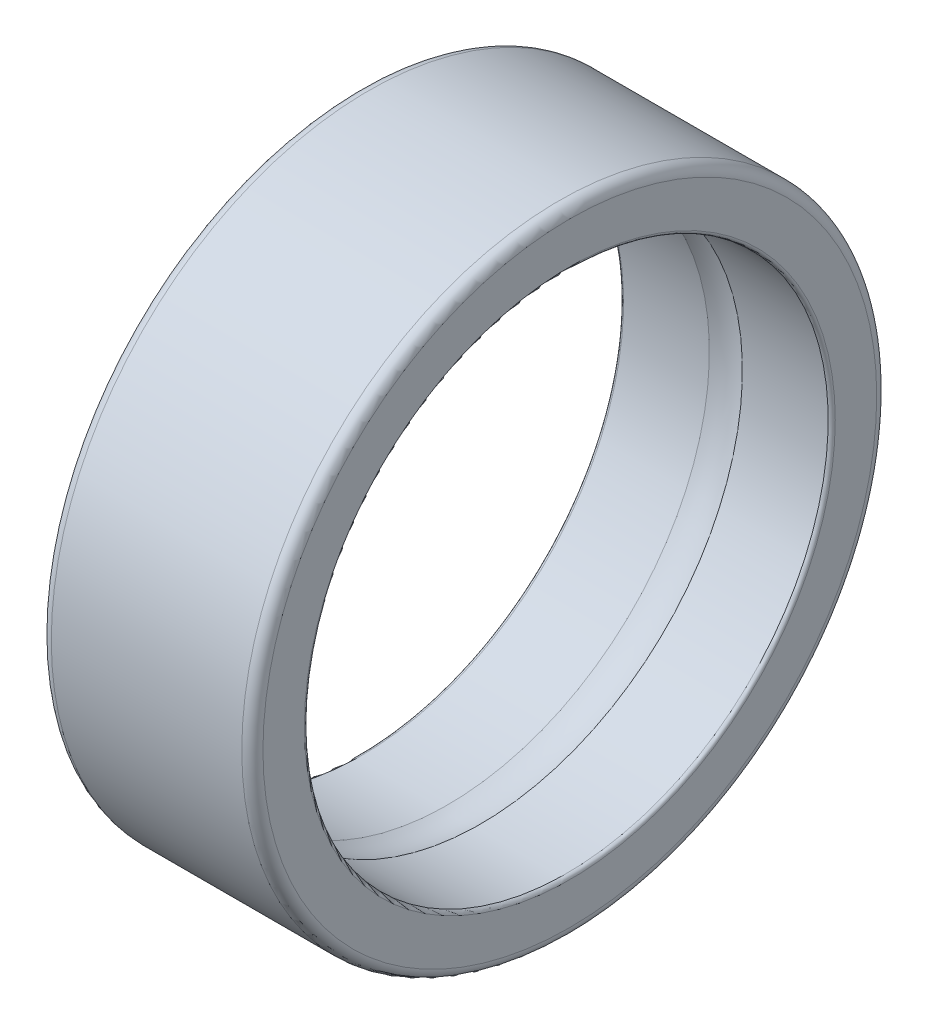
ISO-10303-21;
HEADER;
FILE_DESCRIPTION(('STEP AP214'),'2;1');
FILE_NAME('part.step','',(''),(''),'','','');
FILE_SCHEMA(('AUTOMOTIVE_DESIGN { 1 0 10303 214 1 1 1 1 }'));
ENDSEC;
DATA;
#1=APPLICATION_CONTEXT('core data for automotive mechanical design processes');
#2=APPLICATION_PROTOCOL_DEFINITION('international standard','automotive_design',2000,#1);
#3=PRODUCT_CONTEXT('',#1,'mechanical');
#4=PRODUCT('Part','Part','',(#3));
#5=PRODUCT_RELATED_PRODUCT_CATEGORY('part','',(#4));
#6=PRODUCT_DEFINITION_FORMATION('','',#4);
#7=PRODUCT_DEFINITION_CONTEXT('part definition',#1,'design');
#8=PRODUCT_DEFINITION('design','',#6,#7);
#9=PRODUCT_DEFINITION_SHAPE('','',#8);
#10=(LENGTH_UNIT() NAMED_UNIT(*) SI_UNIT(.MILLI.,.METRE.));
#11=(NAMED_UNIT(*) PLANE_ANGLE_UNIT() SI_UNIT($,.RADIAN.));
#12=(NAMED_UNIT(*) SI_UNIT($,.STERADIAN.) SOLID_ANGLE_UNIT());
#13=UNCERTAINTY_MEASURE_WITH_UNIT(LENGTH_MEASURE(1.E-05),#10,'distance_accuracy_value','');
#14=(GEOMETRIC_REPRESENTATION_CONTEXT(3) GLOBAL_UNCERTAINTY_ASSIGNED_CONTEXT((#13)) GLOBAL_UNIT_ASSIGNED_CONTEXT((#10,
#11,#12)) REPRESENTATION_CONTEXT('',''));
#15=CARTESIAN_POINT('',(0.,0.,0.));
#16=DIRECTION('',(0.,0.,1.));
#17=DIRECTION('',(1.,0.,0.));
#18=AXIS2_PLACEMENT_3D('',#15,#16,#17);
#19=CARTESIAN_POINT('',(0.0666666666667283,0.,0.));
#20=DIRECTION('',(-1.,0.,0.));
#21=DIRECTION('',(0.,0.,1.));
#22=AXIS2_PLACEMENT_3D('',#19,#20,#21);
#23=TOROIDAL_SURFACE('',#22,5.01666666666673,0.0666666666667281);
#24=CARTESIAN_POINT('',(0.0666666666666671,0.,0.));
#25=DIRECTION('',(-1.,0.,0.));
#26=DIRECTION('',(0.,0.,1.));
#27=AXIS2_PLACEMENT_3D('',#24,#25,#26);
#28=CIRCLE('',#27,4.95);
#29=CARTESIAN_POINT('',(0.0666666666666671,0.,4.95));
#30=VERTEX_POINT('',#29);
#31=EDGE_CURVE('E10',#30,#30,#28,.T.);
#32=ORIENTED_EDGE('',*,*,#31,.F.);
#33=EDGE_LOOP('',(#32));
#34=FACE_BOUND('',#33,.T.);
#35=CARTESIAN_POINT('',(0.,0.,0.));
#36=DIRECTION('',(-1.,0.,0.));
#37=DIRECTION('',(0.,0.,1.));
#38=AXIS2_PLACEMENT_3D('',#35,#36,#37);
#39=CIRCLE('',#38,5.0166666666667);
#40=CARTESIAN_POINT('',(0.,0.,5.0166666666667));
#41=VERTEX_POINT('',#40);
#42=EDGE_CURVE('E69',#41,#41,#39,.T.);
#43=ORIENTED_EDGE('',*,*,#42,.T.);
#44=EDGE_LOOP('',(#43));
#45=FACE_BOUND('',#44,.T.);
#46=ADVANCED_FACE('F35',(#34,#45),#23,.T.);
#47=CARTESIAN_POINT('',(4.,0.,0.));
#48=DIRECTION('',(-1.,0.,0.));
#49=DIRECTION('',(0.,0.,1.));
#50=AXIS2_PLACEMENT_3D('',#47,#48,#49);
#51=CYLINDRICAL_SURFACE('',#50,4.95);
#52=CARTESIAN_POINT('',(1.6877501000801,0.,0.));
#53=DIRECTION('',(-1.,0.,0.));
#54=DIRECTION('',(0.,0.,1.));
#55=AXIS2_PLACEMENT_3D('',#52,#53,#54);
#56=CIRCLE('',#55,4.95);
#57=CARTESIAN_POINT('',(1.6877501000801,0.,4.95));
#58=VERTEX_POINT('',#57);
#59=EDGE_CURVE('E41',#58,#58,#56,.T.);
#60=ORIENTED_EDGE('',*,*,#59,.F.);
#61=EDGE_LOOP('',(#60));
#62=FACE_BOUND('',#61,.T.);
#63=ORIENTED_EDGE('',*,*,#31,.T.);
#64=EDGE_LOOP('',(#63));
#65=FACE_BOUND('',#64,.T.);
#66=ADVANCED_FACE('F118',(#62,#65),#51,.F.);
#67=CARTESIAN_POINT('',(2.,0.,0.));
#68=DIRECTION('',(-1.,0.,0.));
#69=DIRECTION('',(0.,0.,1.));
#70=AXIS2_PLACEMENT_3D('',#67,#68,#69);
#71=TOROIDAL_SURFACE('',#70,4.00000000000012,0.999999999999885);
#72=CARTESIAN_POINT('',(2.3122498999199,0.,0.));
#73=DIRECTION('',(-1.,0.,0.));
#74=DIRECTION('',(0.,0.,1.));
#75=AXIS2_PLACEMENT_3D('',#72,#73,#74);
#76=CIRCLE('',#75,4.95);
#77=CARTESIAN_POINT('',(2.3122498999199,0.,4.95));
#78=VERTEX_POINT('',#77);
#79=EDGE_CURVE('E45',#78,#78,#76,.T.);
#80=ORIENTED_EDGE('',*,*,#79,.F.);
#81=EDGE_LOOP('',(#80));
#82=FACE_BOUND('',#81,.T.);
#83=ORIENTED_EDGE('',*,*,#59,.T.);
#84=EDGE_LOOP('',(#83));
#85=FACE_BOUND('',#84,.T.);
#86=ADVANCED_FACE('F113',(#82,#85),#71,.F.);
#87=CARTESIAN_POINT('',(4.,0.,0.));
#88=DIRECTION('',(-1.,0.,0.));
#89=DIRECTION('',(0.,0.,1.));
#90=AXIS2_PLACEMENT_3D('',#87,#88,#89);
#91=CYLINDRICAL_SURFACE('',#90,4.95);
#92=CARTESIAN_POINT('',(3.9333333333333,0.,0.));
#93=DIRECTION('',(-1.,0.,0.));
#94=DIRECTION('',(0.,0.,1.));
#95=AXIS2_PLACEMENT_3D('',#92,#93,#94);
#96=CIRCLE('',#95,4.95);
#97=CARTESIAN_POINT('',(3.9333333333333,0.,4.95));
#98=VERTEX_POINT('',#97);
#99=EDGE_CURVE('E49',#98,#98,#96,.T.);
#100=ORIENTED_EDGE('',*,*,#99,.F.);
#101=EDGE_LOOP('',(#100));
#102=FACE_BOUND('',#101,.T.);
#103=ORIENTED_EDGE('',*,*,#79,.T.);
#104=EDGE_LOOP('',(#103));
#105=FACE_BOUND('',#104,.T.);
#106=ADVANCED_FACE('F107',(#102,#105),#91,.F.);
#107=CARTESIAN_POINT('',(3.93333333333321,0.,0.));
#108=DIRECTION('',(-1.,0.,0.));
#109=DIRECTION('',(0.,0.,1.));
#110=AXIS2_PLACEMENT_3D('',#107,#108,#109);
#111=TOROIDAL_SURFACE('',#110,5.01666666666679,0.066666666666792);
#112=CARTESIAN_POINT('',(4.,0.,0.));
#113=DIRECTION('',(-1.,0.,0.));
#114=DIRECTION('',(0.,0.,1.));
#115=AXIS2_PLACEMENT_3D('',#112,#113,#114);
#116=CIRCLE('',#115,5.01666666666661);
#117=CARTESIAN_POINT('',(4.,0.,5.01666666666661));
#118=VERTEX_POINT('',#117);
#119=EDGE_CURVE('E54',#118,#118,#116,.T.);
#120=ORIENTED_EDGE('',*,*,#119,.F.);
#121=EDGE_LOOP('',(#120));
#122=FACE_BOUND('',#121,.T.);
#123=ORIENTED_EDGE('',*,*,#99,.T.);
#124=EDGE_LOOP('',(#123));
#125=FACE_BOUND('',#124,.T.);
#126=ADVANCED_FACE('F101',(#122,#125),#111,.T.);
#127=CARTESIAN_POINT('',(4.,5.01666666666661,0.));
#128=DIRECTION('',(-1.,0.,0.));
#129=DIRECTION('',(0.,0.,1.));
#130=AXIS2_PLACEMENT_3D('',#127,#128,#129);
#131=PLANE('',#130);
#132=CARTESIAN_POINT('',(4.,0.,0.));
#133=DIRECTION('',(-1.,0.,0.));
#134=DIRECTION('',(0.,0.,1.));
#135=AXIS2_PLACEMENT_3D('',#132,#133,#134);
#136=CIRCLE('',#135,5.8);
#137=CARTESIAN_POINT('',(4.,0.,5.8));
#138=VERTEX_POINT('',#137);
#139=EDGE_CURVE('E57',#138,#138,#136,.T.);
#140=ORIENTED_EDGE('',*,*,#139,.F.);
#141=EDGE_LOOP('',(#140));
#142=FACE_BOUND('',#141,.T.);
#143=ORIENTED_EDGE('',*,*,#119,.T.);
#144=EDGE_LOOP('',(#143));
#145=FACE_BOUND('',#144,.T.);
#146=ADVANCED_FACE('F95',(#142,#145),#131,.F.);
#147=CARTESIAN_POINT('',(3.79999999999997,0.,0.));
#148=DIRECTION('',(-1.,0.,0.));
#149=DIRECTION('',(0.,0.,1.));
#150=AXIS2_PLACEMENT_3D('',#147,#148,#149);
#151=TOROIDAL_SURFACE('',#150,5.79999999999997,0.200000000000033);
#152=CARTESIAN_POINT('',(3.8,0.,0.));
#153=DIRECTION('',(-1.,0.,0.));
#154=DIRECTION('',(0.,0.,1.));
#155=AXIS2_PLACEMENT_3D('',#152,#153,#154);
#156=CIRCLE('',#155,6.);
#157=CARTESIAN_POINT('',(3.8,0.,6.));
#158=VERTEX_POINT('',#157);
#159=EDGE_CURVE('E60',#158,#158,#156,.T.);
#160=ORIENTED_EDGE('',*,*,#159,.F.);
#161=EDGE_LOOP('',(#160));
#162=FACE_BOUND('',#161,.T.);
#163=ORIENTED_EDGE('',*,*,#139,.T.);
#164=EDGE_LOOP('',(#163));
#165=FACE_BOUND('',#164,.T.);
#166=ADVANCED_FACE('F89',(#162,#165),#151,.T.);
#167=CARTESIAN_POINT('',(4.,0.,0.));
#168=DIRECTION('',(-1.,0.,0.));
#169=DIRECTION('',(0.,0.,1.));
#170=AXIS2_PLACEMENT_3D('',#167,#168,#169);
#171=CYLINDRICAL_SURFACE('',#170,6.);
#172=CARTESIAN_POINT('',(0.2,0.,0.));
#173=DIRECTION('',(-1.,0.,0.));
#174=DIRECTION('',(0.,0.,1.));
#175=AXIS2_PLACEMENT_3D('',#172,#173,#174);
#176=CIRCLE('',#175,6.);
#177=CARTESIAN_POINT('',(0.2,0.,6.));
#178=VERTEX_POINT('',#177);
#179=EDGE_CURVE('E63',#178,#178,#176,.T.);
#180=ORIENTED_EDGE('',*,*,#179,.F.);
#181=EDGE_LOOP('',(#180));
#182=FACE_BOUND('',#181,.T.);
#183=ORIENTED_EDGE('',*,*,#159,.T.);
#184=EDGE_LOOP('',(#183));
#185=FACE_BOUND('',#184,.T.);
#186=ADVANCED_FACE('F83',(#182,#185),#171,.T.);
#187=CARTESIAN_POINT('',(0.200000000000017,0.,0.));
#188=DIRECTION('',(-1.,0.,0.));
#189=DIRECTION('',(0.,0.,1.));
#190=AXIS2_PLACEMENT_3D('',#187,#188,#189);
#191=TOROIDAL_SURFACE('',#190,5.79999999999998,0.200000000000017);
#192=CARTESIAN_POINT('',(0.,0.,0.));
#193=DIRECTION('',(-1.,0.,0.));
#194=DIRECTION('',(0.,0.,1.));
#195=AXIS2_PLACEMENT_3D('',#192,#193,#194);
#196=CIRCLE('',#195,5.80000000000002);
#197=CARTESIAN_POINT('',(0.,0.,5.80000000000002));
#198=VERTEX_POINT('',#197);
#199=EDGE_CURVE('E66',#198,#198,#196,.T.);
#200=ORIENTED_EDGE('',*,*,#199,.F.);
#201=EDGE_LOOP('',(#200));
#202=FACE_BOUND('',#201,.T.);
#203=ORIENTED_EDGE('',*,*,#179,.T.);
#204=EDGE_LOOP('',(#203));
#205=FACE_BOUND('',#204,.T.);
#206=ADVANCED_FACE('F77',(#202,#205),#191,.T.);
#207=CARTESIAN_POINT('',(0.,5.80000000000002,0.));
#208=DIRECTION('',(1.,0.,0.));
#209=DIRECTION('',(0.,0.,-1.));
#210=AXIS2_PLACEMENT_3D('',#207,#208,#209);
#211=PLANE('',#210);
#212=ORIENTED_EDGE('',*,*,#42,.F.);
#213=EDGE_LOOP('',(#212));
#214=FACE_BOUND('',#213,.T.);
#215=ORIENTED_EDGE('',*,*,#199,.T.);
#216=EDGE_LOOP('',(#215));
#217=FACE_BOUND('',#216,.T.);
#218=ADVANCED_FACE('F74',(#214,#217),#211,.F.);
#219=CLOSED_SHELL('',(#46,#66,#86,#106,#126,#146,#166,#186,#206,#218));
#220=MANIFOLD_SOLID_BREP('B2',#219);
#221=ADVANCED_BREP_SHAPE_REPRESENTATION('',(#18,#220),#14);
#222=SHAPE_DEFINITION_REPRESENTATION(#9,#221);
ENDSEC;
END-ISO-10303-21;
